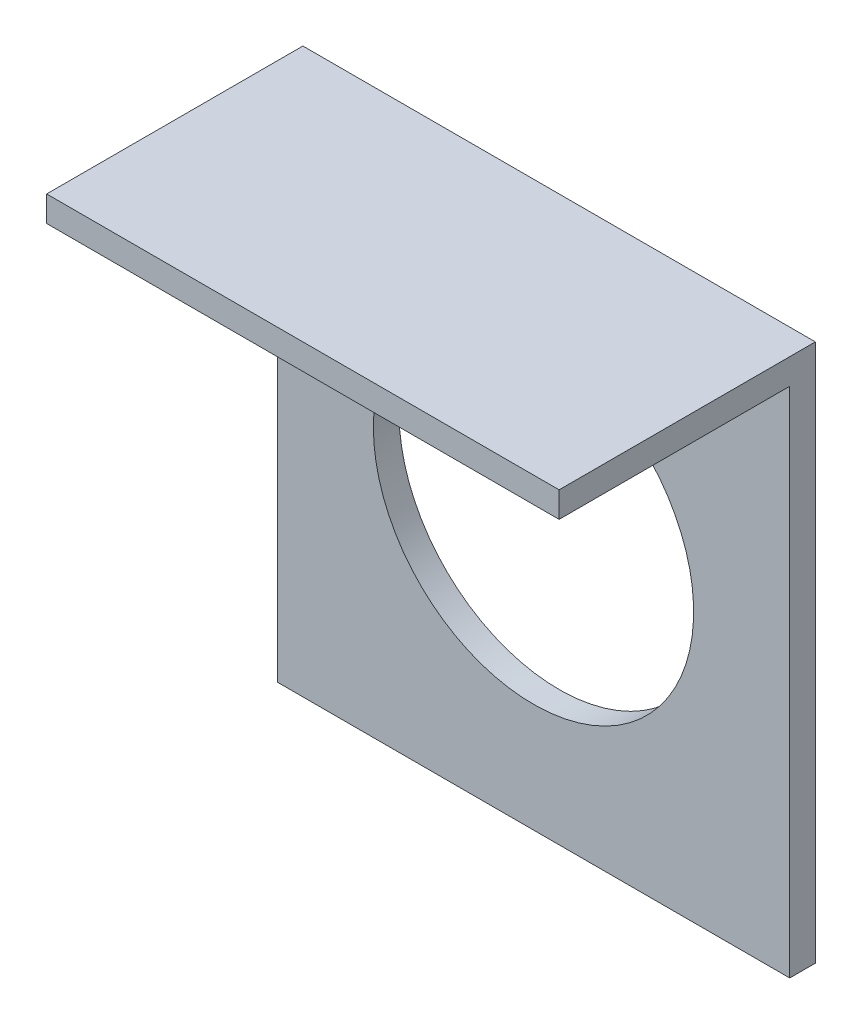
ISO-10303-21;
HEADER;
FILE_DESCRIPTION(('STEP AP214'),'2;1');
FILE_NAME('part.step','',(''),(''),'','','');
FILE_SCHEMA(('AUTOMOTIVE_DESIGN { 1 0 10303 214 1 1 1 1 }'));
ENDSEC;
DATA;
#1=APPLICATION_CONTEXT('core data for automotive mechanical design processes');
#2=APPLICATION_PROTOCOL_DEFINITION('international standard','automotive_design',2000,#1);
#3=PRODUCT_CONTEXT('',#1,'mechanical');
#4=PRODUCT('Part','Part','',(#3));
#5=PRODUCT_RELATED_PRODUCT_CATEGORY('part','',(#4));
#6=PRODUCT_DEFINITION_FORMATION('','',#4);
#7=PRODUCT_DEFINITION_CONTEXT('part definition',#1,'design');
#8=PRODUCT_DEFINITION('design','',#6,#7);
#9=PRODUCT_DEFINITION_SHAPE('','',#8);
#10=(LENGTH_UNIT() NAMED_UNIT(*) SI_UNIT(.MILLI.,.METRE.));
#11=(NAMED_UNIT(*) PLANE_ANGLE_UNIT() SI_UNIT($,.RADIAN.));
#12=(NAMED_UNIT(*) SI_UNIT($,.STERADIAN.) SOLID_ANGLE_UNIT());
#13=UNCERTAINTY_MEASURE_WITH_UNIT(LENGTH_MEASURE(1.E-05),#10,'distance_accuracy_value','');
#14=(GEOMETRIC_REPRESENTATION_CONTEXT(3) GLOBAL_UNCERTAINTY_ASSIGNED_CONTEXT((#13)) GLOBAL_UNIT_ASSIGNED_CONTEXT((#10,
#11,#12)) REPRESENTATION_CONTEXT('',''));
#15=CARTESIAN_POINT('',(0.,0.,0.));
#16=DIRECTION('',(0.,0.,1.));
#17=DIRECTION('',(1.,0.,0.));
#18=AXIS2_PLACEMENT_3D('',#15,#16,#17);
#19=CARTESIAN_POINT('',(0.,0.,2.));
#20=DIRECTION('',(0.,0.,-1.));
#21=DIRECTION('',(-1.,0.,0.));
#22=AXIS2_PLACEMENT_3D('',#19,#20,#21);
#23=PLANE('',#22);
#24=CARTESIAN_POINT('',(0.,0.,2.));
#25=DIRECTION('',(0.,0.,-1.));
#26=DIRECTION('',(-1.,0.,0.));
#27=AXIS2_PLACEMENT_3D('',#24,#25,#26);
#28=CIRCLE('',#27,12.5);
#29=CARTESIAN_POINT('',(-12.5,0.,2.));
#30=VERTEX_POINT('',#29);
#31=EDGE_CURVE('E136',#30,#30,#28,.T.);
#32=ORIENTED_EDGE('',*,*,#31,.T.);
#33=EDGE_LOOP('',(#32));
#34=FACE_BOUND('',#33,.T.);
#35=DIRECTION('',(1.,0.,0.));
#36=VECTOR('',#35,1.);
#37=CARTESIAN_POINT('',(-20.,19.,2.));
#38=LINE('',#37,#36);
#39=CARTESIAN_POINT('',(-20.,19.,2.));
#40=VERTEX_POINT('',#39);
#41=CARTESIAN_POINT('',(20.,19.,2.));
#42=VERTEX_POINT('',#41);
#43=EDGE_CURVE('E49',#40,#42,#38,.T.);
#44=ORIENTED_EDGE('',*,*,#43,.F.);
#45=DIRECTION('',(0.,-1.,0.));
#46=VECTOR('',#45,1.);
#47=CARTESIAN_POINT('',(-20.,-21.,2.));
#48=LINE('',#47,#46);
#49=CARTESIAN_POINT('',(-20.,-21.,2.));
#50=VERTEX_POINT('',#49);
#51=EDGE_CURVE('E138',#40,#50,#48,.T.);
#52=ORIENTED_EDGE('',*,*,#51,.T.);
#53=DIRECTION('',(1.,0.,0.));
#54=VECTOR('',#53,1.);
#55=CARTESIAN_POINT('',(-20.,-21.,2.));
#56=LINE('',#55,#54);
#57=CARTESIAN_POINT('',(20.,-21.,2.));
#58=VERTEX_POINT('',#57);
#59=EDGE_CURVE('E55',#50,#58,#56,.T.);
#60=ORIENTED_EDGE('',*,*,#59,.T.);
#61=DIRECTION('',(0.,1.,0.));
#62=VECTOR('',#61,1.);
#63=CARTESIAN_POINT('',(20.,-21.,2.));
#64=LINE('',#63,#62);
#65=EDGE_CURVE('E84',#58,#42,#64,.T.);
#66=ORIENTED_EDGE('',*,*,#65,.T.);
#67=EDGE_LOOP('',(#44,#52,#60,#66));
#68=FACE_BOUND('',#67,.T.);
#69=ADVANCED_FACE('F34',(#34,#68),#23,.F.);
#70=CARTESIAN_POINT('',(0.,0.,0.));
#71=DIRECTION('',(0.,0.,-1.));
#72=DIRECTION('',(-1.,0.,0.));
#73=AXIS2_PLACEMENT_3D('',#70,#71,#72);
#74=PLANE('',#73);
#75=CARTESIAN_POINT('',(0.,0.,0.));
#76=DIRECTION('',(0.,0.,-1.));
#77=DIRECTION('',(-1.,0.,0.));
#78=AXIS2_PLACEMENT_3D('',#75,#76,#77);
#79=CIRCLE('',#78,12.5);
#80=CARTESIAN_POINT('',(-12.5,0.,0.));
#81=VERTEX_POINT('',#80);
#82=EDGE_CURVE('E241',#81,#81,#79,.T.);
#83=ORIENTED_EDGE('',*,*,#82,.F.);
#84=EDGE_LOOP('',(#83));
#85=FACE_BOUND('',#84,.T.);
#86=DIRECTION('',(0.,1.,0.));
#87=VECTOR('',#86,1.);
#88=CARTESIAN_POINT('',(20.,-21.,0.));
#89=LINE('',#88,#87);
#90=CARTESIAN_POINT('',(20.,-21.,0.));
#91=VERTEX_POINT('',#90);
#92=CARTESIAN_POINT('',(20.,21.,0.));
#93=VERTEX_POINT('',#92);
#94=EDGE_CURVE('E90',#91,#93,#89,.T.);
#95=ORIENTED_EDGE('',*,*,#94,.F.);
#96=DIRECTION('',(1.,0.,0.));
#97=VECTOR('',#96,1.);
#98=CARTESIAN_POINT('',(-20.,-21.,0.));
#99=LINE('',#98,#97);
#100=CARTESIAN_POINT('',(-20.,-21.,0.));
#101=VERTEX_POINT('',#100);
#102=EDGE_CURVE('E74',#101,#91,#99,.T.);
#103=ORIENTED_EDGE('',*,*,#102,.F.);
#104=DIRECTION('',(0.,-1.,0.));
#105=VECTOR('',#104,1.);
#106=CARTESIAN_POINT('',(-20.,-21.,0.));
#107=LINE('',#106,#105);
#108=CARTESIAN_POINT('',(-20.,21.,0.));
#109=VERTEX_POINT('',#108);
#110=EDGE_CURVE('E85',#109,#101,#107,.T.);
#111=ORIENTED_EDGE('',*,*,#110,.F.);
#112=DIRECTION('',(-1.,0.,0.));
#113=VECTOR('',#112,1.);
#114=CARTESIAN_POINT('',(-20.,21.,0.));
#115=LINE('',#114,#113);
#116=EDGE_CURVE('E94',#93,#109,#115,.T.);
#117=ORIENTED_EDGE('',*,*,#116,.F.);
#118=EDGE_LOOP('',(#95,#103,#111,#117));
#119=FACE_BOUND('',#118,.T.);
#120=ADVANCED_FACE('F93',(#85,#119),#74,.T.);
#121=CARTESIAN_POINT('',(20.,-21.,2.));
#122=DIRECTION('',(-1.,0.,0.));
#123=DIRECTION('',(0.,0.,1.));
#124=AXIS2_PLACEMENT_3D('',#121,#122,#123);
#125=PLANE('',#124);
#126=ORIENTED_EDGE('',*,*,#94,.T.);
#127=DIRECTION('',(0.,0.,-1.));
#128=VECTOR('',#127,1.);
#129=CARTESIAN_POINT('',(20.,21.,2.));
#130=LINE('',#129,#128);
#131=CARTESIAN_POINT('',(20.,21.,20.));
#132=VERTEX_POINT('',#131);
#133=EDGE_CURVE('E11',#132,#93,#130,.T.);
#134=ORIENTED_EDGE('',*,*,#133,.F.);
#135=DIRECTION('',(0.,1.,0.));
#136=VECTOR('',#135,1.);
#137=CARTESIAN_POINT('',(20.,21.,20.));
#138=LINE('',#137,#136);
#139=CARTESIAN_POINT('',(20.,19.,20.));
#140=VERTEX_POINT('',#139);
#141=EDGE_CURVE('E127',#140,#132,#138,.T.);
#142=ORIENTED_EDGE('',*,*,#141,.F.);
#143=DIRECTION('',(0.,0.,-1.));
#144=VECTOR('',#143,1.);
#145=CARTESIAN_POINT('',(20.,19.,20.));
#146=LINE('',#145,#144);
#147=EDGE_CURVE('E99',#140,#42,#146,.T.);
#148=ORIENTED_EDGE('',*,*,#147,.T.);
#149=ORIENTED_EDGE('',*,*,#65,.F.);
#150=DIRECTION('',(0.,0.,-1.));
#151=VECTOR('',#150,1.);
#152=CARTESIAN_POINT('',(20.,-21.,2.));
#153=LINE('',#152,#151);
#154=EDGE_CURVE('E77',#58,#91,#153,.T.);
#155=ORIENTED_EDGE('',*,*,#154,.T.);
#156=EDGE_LOOP('',(#126,#134,#142,#148,#149,#155));
#157=FACE_BOUND('',#156,.T.);
#158=ADVANCED_FACE('F36',(#157),#125,.F.);
#159=CARTESIAN_POINT('',(-20.,21.,2.));
#160=DIRECTION('',(0.,-1.,0.));
#161=DIRECTION('',(0.,0.,-1.));
#162=AXIS2_PLACEMENT_3D('',#159,#160,#161);
#163=PLANE('',#162);
#164=ORIENTED_EDGE('',*,*,#116,.T.);
#165=DIRECTION('',(0.,0.,-1.));
#166=VECTOR('',#165,1.);
#167=CARTESIAN_POINT('',(-20.,21.,2.));
#168=LINE('',#167,#166);
#169=CARTESIAN_POINT('',(-20.,21.,20.));
#170=VERTEX_POINT('',#169);
#171=EDGE_CURVE('E42',#170,#109,#168,.T.);
#172=ORIENTED_EDGE('',*,*,#171,.F.);
#173=DIRECTION('',(-1.,0.,0.));
#174=VECTOR('',#173,1.);
#175=CARTESIAN_POINT('',(-20.,21.,20.));
#176=LINE('',#175,#174);
#177=EDGE_CURVE('E119',#132,#170,#176,.T.);
#178=ORIENTED_EDGE('',*,*,#177,.F.);
#179=ORIENTED_EDGE('',*,*,#133,.T.);
#180=EDGE_LOOP('',(#164,#172,#178,#179));
#181=FACE_BOUND('',#180,.T.);
#182=ADVANCED_FACE('F117',(#181),#163,.F.);
#183=CARTESIAN_POINT('',(-20.,-21.,2.));
#184=DIRECTION('',(1.,0.,0.));
#185=DIRECTION('',(0.,0.,-1.));
#186=AXIS2_PLACEMENT_3D('',#183,#184,#185);
#187=PLANE('',#186);
#188=ORIENTED_EDGE('',*,*,#110,.T.);
#189=DIRECTION('',(0.,0.,-1.));
#190=VECTOR('',#189,1.);
#191=CARTESIAN_POINT('',(-20.,-21.,2.));
#192=LINE('',#191,#190);
#193=EDGE_CURVE('E80',#50,#101,#192,.T.);
#194=ORIENTED_EDGE('',*,*,#193,.F.);
#195=ORIENTED_EDGE('',*,*,#51,.F.);
#196=DIRECTION('',(0.,0.,-1.));
#197=VECTOR('',#196,1.);
#198=CARTESIAN_POINT('',(-20.,19.,20.));
#199=LINE('',#198,#197);
#200=CARTESIAN_POINT('',(-20.,19.,20.));
#201=VERTEX_POINT('',#200);
#202=EDGE_CURVE('E95',#201,#40,#199,.T.);
#203=ORIENTED_EDGE('',*,*,#202,.F.);
#204=DIRECTION('',(0.,-1.,0.));
#205=VECTOR('',#204,1.);
#206=CARTESIAN_POINT('',(-20.,21.,20.));
#207=LINE('',#206,#205);
#208=EDGE_CURVE('E113',#170,#201,#207,.T.);
#209=ORIENTED_EDGE('',*,*,#208,.F.);
#210=ORIENTED_EDGE('',*,*,#171,.T.);
#211=EDGE_LOOP('',(#188,#194,#195,#203,#209,#210));
#212=FACE_BOUND('',#211,.T.);
#213=ADVANCED_FACE('F109',(#212),#187,.F.);
#214=CARTESIAN_POINT('',(-20.,-21.,2.));
#215=DIRECTION('',(0.,1.,0.));
#216=DIRECTION('',(0.,0.,1.));
#217=AXIS2_PLACEMENT_3D('',#214,#215,#216);
#218=PLANE('',#217);
#219=ORIENTED_EDGE('',*,*,#102,.T.);
#220=ORIENTED_EDGE('',*,*,#154,.F.);
#221=ORIENTED_EDGE('',*,*,#59,.F.);
#222=ORIENTED_EDGE('',*,*,#193,.T.);
#223=EDGE_LOOP('',(#219,#220,#221,#222));
#224=FACE_BOUND('',#223,.T.);
#225=ADVANCED_FACE('F76',(#224),#218,.F.);
#226=CARTESIAN_POINT('',(-20.,19.,20.));
#227=DIRECTION('',(0.,1.,0.));
#228=DIRECTION('',(0.,0.,1.));
#229=AXIS2_PLACEMENT_3D('',#226,#227,#228);
#230=PLANE('',#229);
#231=ORIENTED_EDGE('',*,*,#43,.T.);
#232=ORIENTED_EDGE('',*,*,#147,.F.);
#233=DIRECTION('',(1.,0.,0.));
#234=VECTOR('',#233,1.);
#235=CARTESIAN_POINT('',(-20.,19.,20.));
#236=LINE('',#235,#234);
#237=EDGE_CURVE('E129',#201,#140,#236,.T.);
#238=ORIENTED_EDGE('',*,*,#237,.F.);
#239=ORIENTED_EDGE('',*,*,#202,.T.);
#240=EDGE_LOOP('',(#231,#232,#238,#239));
#241=FACE_BOUND('',#240,.T.);
#242=ADVANCED_FACE('F141',(#241),#230,.F.);
#243=CARTESIAN_POINT('',(0.,0.,20.));
#244=DIRECTION('',(0.,0.,1.));
#245=DIRECTION('',(1.,0.,0.));
#246=AXIS2_PLACEMENT_3D('',#243,#244,#245);
#247=PLANE('',#246);
#248=ORIENTED_EDGE('',*,*,#141,.T.);
#249=ORIENTED_EDGE('',*,*,#177,.T.);
#250=ORIENTED_EDGE('',*,*,#208,.T.);
#251=ORIENTED_EDGE('',*,*,#237,.T.);
#252=EDGE_LOOP('',(#248,#249,#250,#251));
#253=FACE_BOUND('',#252,.T.);
#254=ADVANCED_FACE('F124',(#253),#247,.T.);
#255=CARTESIAN_POINT('',(0.,0.,2.));
#256=DIRECTION('',(0.,0.,-1.));
#257=DIRECTION('',(-1.,0.,0.));
#258=AXIS2_PLACEMENT_3D('',#255,#256,#257);
#259=CYLINDRICAL_SURFACE('',#258,12.5);
#260=ORIENTED_EDGE('',*,*,#31,.F.);
#261=EDGE_LOOP('',(#260));
#262=FACE_BOUND('',#261,.T.);
#263=ORIENTED_EDGE('',*,*,#82,.T.);
#264=EDGE_LOOP('',(#263));
#265=FACE_BOUND('',#264,.T.);
#266=ADVANCED_FACE('F153',(#262,#265),#259,.F.);
#267=CLOSED_SHELL('',(#69,#120,#158,#182,#213,#225,#242,#254,#266));
#268=MANIFOLD_SOLID_BREP('B2',#267);
#269=ADVANCED_BREP_SHAPE_REPRESENTATION('',(#18,#268),#14);
#270=SHAPE_DEFINITION_REPRESENTATION(#9,#269);
ENDSEC;
END-ISO-10303-21;
